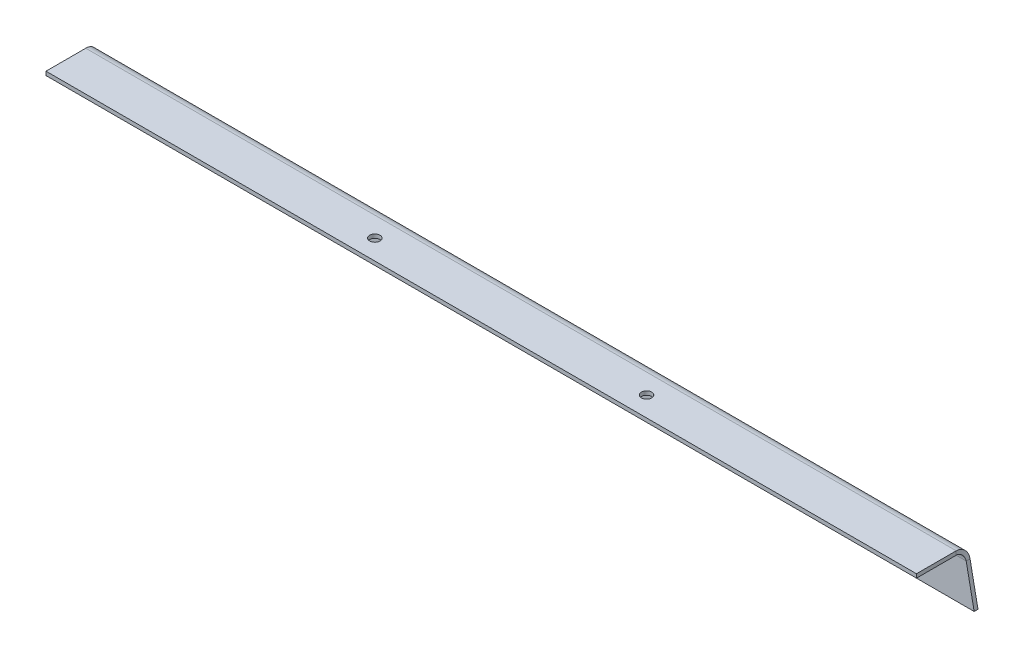
ISO-10303-21;
HEADER;
FILE_DESCRIPTION(('STEP AP214'),'2;1');
FILE_NAME('part.step','',(''),(''),'','','');
FILE_SCHEMA(('AUTOMOTIVE_DESIGN { 1 0 10303 214 1 1 1 1 }'));
ENDSEC;
DATA;
#1=APPLICATION_CONTEXT('core data for automotive mechanical design processes');
#2=APPLICATION_PROTOCOL_DEFINITION('international standard','automotive_design',2000,#1);
#3=PRODUCT_CONTEXT('',#1,'mechanical');
#4=PRODUCT('Part','Part','',(#3));
#5=PRODUCT_RELATED_PRODUCT_CATEGORY('part','',(#4));
#6=PRODUCT_DEFINITION_FORMATION('','',#4);
#7=PRODUCT_DEFINITION_CONTEXT('part definition',#1,'design');
#8=PRODUCT_DEFINITION('design','',#6,#7);
#9=PRODUCT_DEFINITION_SHAPE('','',#8);
#10=(LENGTH_UNIT() NAMED_UNIT(*) SI_UNIT(.MILLI.,.METRE.));
#11=(NAMED_UNIT(*) PLANE_ANGLE_UNIT() SI_UNIT($,.RADIAN.));
#12=(NAMED_UNIT(*) SI_UNIT($,.STERADIAN.) SOLID_ANGLE_UNIT());
#13=UNCERTAINTY_MEASURE_WITH_UNIT(LENGTH_MEASURE(1.E-05),#10,'distance_accuracy_value','');
#14=(GEOMETRIC_REPRESENTATION_CONTEXT(3) GLOBAL_UNCERTAINTY_ASSIGNED_CONTEXT((#13)) GLOBAL_UNIT_ASSIGNED_CONTEXT((#10,
#11,#12)) REPRESENTATION_CONTEXT('',''));
#15=CARTESIAN_POINT('',(0.,0.,0.));
#16=DIRECTION('',(0.,0.,1.));
#17=DIRECTION('',(1.,0.,0.));
#18=AXIS2_PLACEMENT_3D('',#15,#16,#17);
#19=CARTESIAN_POINT('',(0.,0.,-3.));
#20=DIRECTION('',(0.,0.,1.));
#21=DIRECTION('',(1.,0.,0.));
#22=AXIS2_PLACEMENT_3D('',#19,#20,#21);
#23=PLANE('',#22);
#24=DIRECTION('',(0.196116135138184,0.98058067569092,0.));
#25=VECTOR('',#24,1.);
#26=CARTESIAN_POINT('',(-446.554131054131,89.310826210826,-3.));
#27=LINE('',#26,#25);
#28=CARTESIAN_POINT('',(-467.259259259259,-14.2148148148148,-3.));
#29=VERTEX_POINT('',#28);
#30=CARTESIAN_POINT('',(-461.059259259259,16.7851851851852,-3.));
#31=VERTEX_POINT('',#30);
#32=EDGE_CURVE('E86',#29,#31,#27,.T.);
#33=ORIENTED_EDGE('',*,*,#32,.T.);
#34=DIRECTION('',(-1.,0.,0.));
#35=VECTOR('',#34,1.);
#36=CARTESIAN_POINT('',(-467.259259259259,16.7851851851852,-3.00000000000003));
#37=LINE('',#36,#35);
#38=CARTESIAN_POINT('',(221.540740740741,16.7851851851852,-3.00000000000001));
#39=VERTEX_POINT('',#38);
#40=EDGE_CURVE('E155',#31,#39,#37,.F.);
#41=ORIENTED_EDGE('',*,*,#40,.T.);
#42=DIRECTION('',(-0.196116135138184,0.98058067569092,0.));
#43=VECTOR('',#42,1.);
#44=CARTESIAN_POINT('',(219.740740740741,25.7851851851853,-3.));
#45=LINE('',#44,#43);
#46=CARTESIAN_POINT('',(227.740740740741,-14.2148148148148,-3.));
#47=VERTEX_POINT('',#46);
#48=EDGE_CURVE('E192',#47,#39,#45,.T.);
#49=ORIENTED_EDGE('',*,*,#48,.F.);
#50=DIRECTION('',(1.,0.,0.));
#51=VECTOR('',#50,1.);
#52=CARTESIAN_POINT('',(227.740740740741,-14.2148148148148,-3.));
#53=LINE('',#52,#51);
#54=EDGE_CURVE('E169',#29,#47,#53,.T.);
#55=ORIENTED_EDGE('',*,*,#54,.F.);
#56=EDGE_LOOP('',(#33,#41,#49,#55));
#57=FACE_BOUND('',#56,.T.);
#58=ADVANCED_FACE('F61',(#57),#23,.F.);
#59=CARTESIAN_POINT('',(0.,0.,0.));
#60=DIRECTION('',(0.,0.,1.));
#61=DIRECTION('',(1.,0.,0.));
#62=AXIS2_PLACEMENT_3D('',#59,#60,#61);
#63=PLANE('',#62);
#64=DIRECTION('',(-1.,0.,0.));
#65=VECTOR('',#64,1.);
#66=CARTESIAN_POINT('',(-467.259259259259,16.7851851851852,0.));
#67=LINE('',#66,#65);
#68=CARTESIAN_POINT('',(-461.059259259259,16.7851851851852,0.));
#69=VERTEX_POINT('',#68);
#70=CARTESIAN_POINT('',(221.540740740741,16.7851851851852,0.));
#71=VERTEX_POINT('',#70);
#72=EDGE_CURVE('E152',#69,#71,#67,.F.);
#73=ORIENTED_EDGE('',*,*,#72,.F.);
#74=DIRECTION('',(0.196116135138184,0.98058067569092,0.));
#75=VECTOR('',#74,1.);
#76=CARTESIAN_POINT('',(-446.554131054131,89.310826210826,0.));
#77=LINE('',#76,#75);
#78=CARTESIAN_POINT('',(-467.259259259259,-14.2148148148148,0.));
#79=VERTEX_POINT('',#78);
#80=EDGE_CURVE('E217',#79,#69,#77,.T.);
#81=ORIENTED_EDGE('',*,*,#80,.F.);
#82=DIRECTION('',(1.,0.,0.));
#83=VECTOR('',#82,1.);
#84=CARTESIAN_POINT('',(227.740740740741,-14.2148148148148,0.));
#85=LINE('',#84,#83);
#86=CARTESIAN_POINT('',(227.740740740741,-14.2148148148148,0.));
#87=VERTEX_POINT('',#86);
#88=EDGE_CURVE('E167',#79,#87,#85,.T.);
#89=ORIENTED_EDGE('',*,*,#88,.T.);
#90=DIRECTION('',(-0.196116135138184,0.98058067569092,0.));
#91=VECTOR('',#90,1.);
#92=CARTESIAN_POINT('',(219.740740740741,25.7851851851853,0.));
#93=LINE('',#92,#91);
#94=EDGE_CURVE('E189',#87,#71,#93,.T.);
#95=ORIENTED_EDGE('',*,*,#94,.T.);
#96=EDGE_LOOP('',(#73,#81,#89,#95));
#97=FACE_BOUND('',#96,.T.);
#98=ADVANCED_FACE('F240',(#97),#63,.T.);
#99=CARTESIAN_POINT('',(-467.259259259259,16.7851851851852,6.00000000000001));
#100=DIRECTION('',(-1.,0.,0.));
#101=DIRECTION('',(0.,1.,0.));
#102=AXIS2_PLACEMENT_3D('',#99,#100,#101);
#103=CYLINDRICAL_SURFACE('',#102,9.00000000000004);
#104=ORIENTED_EDGE('',*,*,#40,.F.);
#105=CARTESIAN_POINT('',(-461.059259259259,16.7851851851852,6.00000000000001));
#106=DIRECTION('',(0.98058067569092,-0.196116135138184,0.));
#107=DIRECTION('',(-0.196116135138184,-0.98058067569092,0.));
#108=AXIS2_PLACEMENT_3D('',#105,#106,#107);
#109=ELLIPSE('',#108,9.17823512446706,9.00000000000004);
#110=CARTESIAN_POINT('',(-459.259259259259,25.7851851851853,5.99999999999997));
#111=VERTEX_POINT('',#110);
#112=EDGE_CURVE('E207',#111,#31,#109,.F.);
#113=ORIENTED_EDGE('',*,*,#112,.F.);
#114=DIRECTION('',(-1.,0.,0.));
#115=VECTOR('',#114,1.);
#116=CARTESIAN_POINT('',(0.,25.7851851851852,5.99999999999997));
#117=LINE('',#116,#115);
#118=CARTESIAN_POINT('',(219.740740740741,25.7851851851853,5.99999999999997));
#119=VERTEX_POINT('',#118);
#120=EDGE_CURVE('E148',#119,#111,#117,.T.);
#121=ORIENTED_EDGE('',*,*,#120,.F.);
#122=CARTESIAN_POINT('',(221.540740740741,16.7851851851852,6.00000000000001));
#123=DIRECTION('',(-0.98058067569092,-0.196116135138184,0.));
#124=DIRECTION('',(-0.196116135138184,0.98058067569092,0.));
#125=AXIS2_PLACEMENT_3D('',#122,#123,#124);
#126=ELLIPSE('',#125,9.17823512446706,9.00000000000004);
#127=EDGE_CURVE('E205',#39,#119,#126,.F.);
#128=ORIENTED_EDGE('',*,*,#127,.F.);
#129=EDGE_LOOP('',(#104,#113,#121,#128));
#130=FACE_BOUND('',#129,.T.);
#131=ADVANCED_FACE('F248',(#130),#103,.T.);
#132=CARTESIAN_POINT('',(-467.259259259259,16.7851851851852,6.00000000000001));
#133=DIRECTION('',(-1.,0.,0.));
#134=DIRECTION('',(0.,1.,0.));
#135=AXIS2_PLACEMENT_3D('',#132,#133,#134);
#136=CYLINDRICAL_SURFACE('',#135,6.00000000000004);
#137=CARTESIAN_POINT('',(-461.059259259259,16.7851851851852,6.00000000000001));
#138=DIRECTION('',(0.957826285221151,-0.287347885566347,0.));
#139=DIRECTION('',(-0.287347885566347,-0.957826285221151,0.));
#140=AXIS2_PLACEMENT_3D('',#137,#138,#139);
#141=ELLIPSE('',#140,6.26418390534638,6.00000000000004);
#142=CARTESIAN_POINT('',(-459.259259259259,22.7851851851853,5.99999999999999));
#143=VERTEX_POINT('',#142);
#144=EDGE_CURVE('E210',#143,#69,#141,.F.);
#145=ORIENTED_EDGE('',*,*,#144,.T.);
#146=ORIENTED_EDGE('',*,*,#72,.T.);
#147=CARTESIAN_POINT('',(221.540740740741,16.7851851851852,6.00000000000001));
#148=DIRECTION('',(-0.957826285221152,-0.287347885566343,0.));
#149=DIRECTION('',(-0.287347885566343,0.957826285221152,0.));
#150=AXIS2_PLACEMENT_3D('',#147,#148,#149);
#151=ELLIPSE('',#150,6.26418390534637,6.00000000000004);
#152=CARTESIAN_POINT('',(219.740740740741,22.7851851851853,5.99999999999998));
#153=VERTEX_POINT('',#152);
#154=EDGE_CURVE('E203',#71,#153,#151,.F.);
#155=ORIENTED_EDGE('',*,*,#154,.T.);
#156=DIRECTION('',(1.,0.,0.));
#157=VECTOR('',#156,1.);
#158=CARTESIAN_POINT('',(227.740740740741,22.7851851851853,5.99999999999998));
#159=LINE('',#158,#157);
#160=EDGE_CURVE('E163',#153,#143,#159,.F.);
#161=ORIENTED_EDGE('',*,*,#160,.T.);
#162=EDGE_LOOP('',(#145,#146,#155,#161));
#163=FACE_BOUND('',#162,.T.);
#164=ADVANCED_FACE('F229',(#163),#136,.F.);
#165=CARTESIAN_POINT('',(0.,25.7851851851852,0.));
#166=DIRECTION('',(0.,1.,0.));
#167=DIRECTION('',(0.,0.,1.));
#168=AXIS2_PLACEMENT_3D('',#165,#166,#167);
#169=PLANE('',#168);
#170=CARTESIAN_POINT('',(-6.25925925925926,25.7851851851853,21.5));
#171=DIRECTION('',(0.,1.,0.));
#172=DIRECTION('',(0.,0.,1.));
#173=AXIS2_PLACEMENT_3D('',#170,#171,#172);
#174=CIRCLE('',#173,4.);
#175=CARTESIAN_POINT('',(-6.25925925925926,25.7851851851853,25.5));
#176=VERTEX_POINT('',#175);
#177=EDGE_CURVE('E181',#176,#176,#174,.T.);
#178=ORIENTED_EDGE('',*,*,#177,.F.);
#179=EDGE_LOOP('',(#178));
#180=FACE_BOUND('',#179,.T.);
#181=CARTESIAN_POINT('',(-218.259259259259,25.7851851851853,21.5));
#182=DIRECTION('',(0.,1.,0.));
#183=DIRECTION('',(0.,0.,1.));
#184=AXIS2_PLACEMENT_3D('',#181,#182,#183);
#185=CIRCLE('',#184,3.99999999999999);
#186=CARTESIAN_POINT('',(-218.259259259259,25.7851851851853,25.5));
#187=VERTEX_POINT('',#186);
#188=EDGE_CURVE('E159',#187,#187,#185,.T.);
#189=ORIENTED_EDGE('',*,*,#188,.F.);
#190=EDGE_LOOP('',(#189));
#191=FACE_BOUND('',#190,.T.);
#192=ORIENTED_EDGE('',*,*,#120,.T.);
#193=DIRECTION('',(0.,0.,-1.));
#194=VECTOR('',#193,1.);
#195=CARTESIAN_POINT('',(-459.259259259259,25.7851851851853,37.));
#196=LINE('',#195,#194);
#197=CARTESIAN_POINT('',(-459.259259259259,25.7851851851853,37.));
#198=VERTEX_POINT('',#197);
#199=EDGE_CURVE('E133',#198,#111,#196,.T.);
#200=ORIENTED_EDGE('',*,*,#199,.F.);
#201=DIRECTION('',(-1.,0.,0.));
#202=VECTOR('',#201,1.);
#203=CARTESIAN_POINT('',(-467.259259259259,25.7851851851853,37.));
#204=LINE('',#203,#202);
#205=CARTESIAN_POINT('',(219.740740740741,25.7851851851854,37.));
#206=VERTEX_POINT('',#205);
#207=EDGE_CURVE('E146',#206,#198,#204,.T.);
#208=ORIENTED_EDGE('',*,*,#207,.F.);
#209=DIRECTION('',(0.,0.,-1.));
#210=VECTOR('',#209,1.);
#211=CARTESIAN_POINT('',(219.740740740741,25.7851851851853,37.));
#212=LINE('',#211,#210);
#213=EDGE_CURVE('E78',#206,#119,#212,.T.);
#214=ORIENTED_EDGE('',*,*,#213,.T.);
#215=EDGE_LOOP('',(#192,#200,#208,#214));
#216=FACE_BOUND('',#215,.T.);
#217=ADVANCED_FACE('F145',(#180,#191,#216),#169,.T.);
#218=CARTESIAN_POINT('',(0.,22.7851851851852,0.));
#219=DIRECTION('',(0.,1.,0.));
#220=DIRECTION('',(0.,0.,1.));
#221=AXIS2_PLACEMENT_3D('',#218,#219,#220);
#222=PLANE('',#221);
#223=CARTESIAN_POINT('',(-6.25925925925926,22.7851851851853,21.5));
#224=DIRECTION('',(0.,1.,0.));
#225=DIRECTION('',(0.,0.,1.));
#226=AXIS2_PLACEMENT_3D('',#223,#224,#225);
#227=CIRCLE('',#226,4.);
#228=CARTESIAN_POINT('',(-6.25925925925926,22.7851851851853,25.5));
#229=VERTEX_POINT('',#228);
#230=EDGE_CURVE('E65',#229,#229,#227,.T.);
#231=ORIENTED_EDGE('',*,*,#230,.T.);
#232=EDGE_LOOP('',(#231));
#233=FACE_BOUND('',#232,.T.);
#234=CARTESIAN_POINT('',(-218.259259259259,22.7851851851853,21.5));
#235=DIRECTION('',(0.,1.,0.));
#236=DIRECTION('',(0.,0.,1.));
#237=AXIS2_PLACEMENT_3D('',#234,#235,#236);
#238=CIRCLE('',#237,3.99999999999999);
#239=CARTESIAN_POINT('',(-218.259259259259,22.7851851851853,25.5));
#240=VERTEX_POINT('',#239);
#241=EDGE_CURVE('E166',#240,#240,#238,.T.);
#242=ORIENTED_EDGE('',*,*,#241,.T.);
#243=EDGE_LOOP('',(#242));
#244=FACE_BOUND('',#243,.T.);
#245=DIRECTION('',(0.,0.,1.));
#246=VECTOR('',#245,1.);
#247=CARTESIAN_POINT('',(-459.259259259259,22.7851851851852,0.));
#248=LINE('',#247,#246);
#249=CARTESIAN_POINT('',(-459.259259259259,22.7851851851853,37.));
#250=VERTEX_POINT('',#249);
#251=EDGE_CURVE('E136',#250,#143,#248,.F.);
#252=ORIENTED_EDGE('',*,*,#251,.T.);
#253=ORIENTED_EDGE('',*,*,#160,.F.);
#254=DIRECTION('',(0.,0.,1.));
#255=VECTOR('',#254,1.);
#256=CARTESIAN_POINT('',(219.740740740741,22.7851851851852,0.));
#257=LINE('',#256,#255);
#258=CARTESIAN_POINT('',(219.740740740741,22.7851851851854,37.));
#259=VERTEX_POINT('',#258);
#260=EDGE_CURVE('E200',#259,#153,#257,.F.);
#261=ORIENTED_EDGE('',*,*,#260,.F.);
#262=DIRECTION('',(1.,0.,0.));
#263=VECTOR('',#262,1.);
#264=CARTESIAN_POINT('',(0.,22.7851851851853,37.));
#265=LINE('',#264,#263);
#266=EDGE_CURVE('E153',#259,#250,#265,.F.);
#267=ORIENTED_EDGE('',*,*,#266,.T.);
#268=EDGE_LOOP('',(#252,#253,#261,#267));
#269=FACE_BOUND('',#268,.T.);
#270=ADVANCED_FACE('F226',(#233,#244,#269),#222,.F.);
#271=CARTESIAN_POINT('',(-467.259259259259,25.7851851851853,37.));
#272=DIRECTION('',(0.,0.,1.));
#273=DIRECTION('',(0.,-1.,0.));
#274=AXIS2_PLACEMENT_3D('',#271,#272,#273);
#275=PLANE('',#274);
#276=ORIENTED_EDGE('',*,*,#207,.T.);
#277=DIRECTION('',(0.,1.,0.));
#278=VECTOR('',#277,1.);
#279=CARTESIAN_POINT('',(-459.259259259259,25.7851851851853,37.));
#280=LINE('',#279,#278);
#281=EDGE_CURVE('E129',#198,#250,#280,.F.);
#282=ORIENTED_EDGE('',*,*,#281,.T.);
#283=ORIENTED_EDGE('',*,*,#266,.F.);
#284=DIRECTION('',(0.,1.,0.));
#285=VECTOR('',#284,1.);
#286=CARTESIAN_POINT('',(219.740740740741,25.7851851851854,37.));
#287=LINE('',#286,#285);
#288=EDGE_CURVE('E151',#206,#259,#287,.F.);
#289=ORIENTED_EDGE('',*,*,#288,.F.);
#290=EDGE_LOOP('',(#276,#282,#283,#289));
#291=FACE_BOUND('',#290,.T.);
#292=ADVANCED_FACE('F150',(#291),#275,.T.);
#293=CARTESIAN_POINT('',(227.740740740741,-14.2148148148148,-3.));
#294=DIRECTION('',(0.,-1.,0.));
#295=DIRECTION('',(1.,0.,0.));
#296=AXIS2_PLACEMENT_3D('',#293,#294,#295);
#297=PLANE('',#296);
#298=ORIENTED_EDGE('',*,*,#88,.F.);
#299=DIRECTION('',(0.,0.,1.));
#300=VECTOR('',#299,1.);
#301=CARTESIAN_POINT('',(-467.259259259259,-14.2148148148148,-3.));
#302=LINE('',#301,#300);
#303=EDGE_CURVE('E70',#29,#79,#302,.T.);
#304=ORIENTED_EDGE('',*,*,#303,.F.);
#305=ORIENTED_EDGE('',*,*,#54,.T.);
#306=DIRECTION('',(0.,0.,1.));
#307=VECTOR('',#306,1.);
#308=CARTESIAN_POINT('',(227.740740740741,-14.2148148148148,-3.));
#309=LINE('',#308,#307);
#310=EDGE_CURVE('E13',#47,#87,#309,.T.);
#311=ORIENTED_EDGE('',*,*,#310,.T.);
#312=EDGE_LOOP('',(#298,#304,#305,#311));
#313=FACE_BOUND('',#312,.T.);
#314=ADVANCED_FACE('F63',(#313),#297,.T.);
#315=CARTESIAN_POINT('',(-218.259259259259,-14.2148148148149,21.5000000000001));
#316=DIRECTION('',(0.,1.,0.));
#317=DIRECTION('',(0.,0.,1.));
#318=AXIS2_PLACEMENT_3D('',#315,#316,#317);
#319=CYLINDRICAL_SURFACE('',#318,3.99999999999999);
#320=ORIENTED_EDGE('',*,*,#188,.T.);
#321=EDGE_LOOP('',(#320));
#322=FACE_BOUND('',#321,.T.);
#323=ORIENTED_EDGE('',*,*,#241,.F.);
#324=EDGE_LOOP('',(#323));
#325=FACE_BOUND('',#324,.T.);
#326=ADVANCED_FACE('F276',(#322,#325),#319,.F.);
#327=CARTESIAN_POINT('',(-6.25925925925925,-14.2148148148149,21.5000000000001));
#328=DIRECTION('',(0.,1.,0.));
#329=DIRECTION('',(0.,0.,1.));
#330=AXIS2_PLACEMENT_3D('',#327,#328,#329);
#331=CYLINDRICAL_SURFACE('',#330,4.);
#332=ORIENTED_EDGE('',*,*,#177,.T.);
#333=EDGE_LOOP('',(#332));
#334=FACE_BOUND('',#333,.T.);
#335=ORIENTED_EDGE('',*,*,#230,.F.);
#336=EDGE_LOOP('',(#335));
#337=FACE_BOUND('',#336,.T.);
#338=ADVANCED_FACE('F257',(#334,#337),#331,.F.);
#339=CARTESIAN_POINT('',(219.740740740741,25.7851851851853,-3.));
#340=DIRECTION('',(0.98058067569092,0.196116135138184,0.));
#341=DIRECTION('',(-0.196116135138184,0.98058067569092,0.));
#342=AXIS2_PLACEMENT_3D('',#339,#340,#341);
#343=PLANE('',#342);
#344=ORIENTED_EDGE('',*,*,#310,.F.);
#345=ORIENTED_EDGE('',*,*,#48,.T.);
#346=DIRECTION('',(0.,0.,-1.));
#347=VECTOR('',#346,1.);
#348=CARTESIAN_POINT('',(221.540740740741,16.7851851851852,-3.00000000000001));
#349=LINE('',#348,#347);
#350=EDGE_CURVE('E185',#39,#71,#349,.F.);
#351=ORIENTED_EDGE('',*,*,#350,.T.);
#352=ORIENTED_EDGE('',*,*,#94,.F.);
#353=EDGE_LOOP('',(#344,#345,#351,#352));
#354=FACE_BOUND('',#353,.T.);
#355=ADVANCED_FACE('F237',(#354),#343,.T.);
#356=CARTESIAN_POINT('',(219.740740740741,25.7851851851853,37.));
#357=DIRECTION('',(1.,0.,0.));
#358=DIRECTION('',(0.,0.,-1.));
#359=AXIS2_PLACEMENT_3D('',#356,#357,#358);
#360=PLANE('',#359);
#361=ORIENTED_EDGE('',*,*,#213,.F.);
#362=ORIENTED_EDGE('',*,*,#288,.T.);
#363=ORIENTED_EDGE('',*,*,#260,.T.);
#364=DIRECTION('',(0.,1.,0.));
#365=VECTOR('',#364,1.);
#366=CARTESIAN_POINT('',(219.740740740741,25.7851851851853,5.99999999999997));
#367=LINE('',#366,#365);
#368=EDGE_CURVE('E197',#119,#153,#367,.F.);
#369=ORIENTED_EDGE('',*,*,#368,.F.);
#370=EDGE_LOOP('',(#361,#362,#363,#369));
#371=FACE_BOUND('',#370,.T.);
#372=ADVANCED_FACE('F249',(#371),#360,.T.);
#373=CARTESIAN_POINT('',(219.740740740741,25.7851851851853,6.00000000000001));
#374=CARTESIAN_POINT('',(219.740740740741,24.7851851851853,6.00000000000001));
#375=CARTESIAN_POINT('',(219.740740740741,23.7851851851853,6.00000000000001));
#376=CARTESIAN_POINT('',(219.740740740741,22.7851851851853,6.00000000000001));
#377=CARTESIAN_POINT('',(219.740740740741,25.7851851851853,24.0000000000001));
#378=CARTESIAN_POINT('',(219.740740740741,24.7851851851853,22.0000000000001));
#379=CARTESIAN_POINT('',(219.740740740741,23.7851851851853,20.0000000000001));
#380=CARTESIAN_POINT('',(219.740740740741,22.7851851851853,18.0000000000001));
#381=CARTESIAN_POINT('',(223.340740740741,7.78518518518518,24.0000000000001));
#382=CARTESIAN_POINT('',(223.340740740741,8.78518518518518,22.0000000000001));
#383=CARTESIAN_POINT('',(223.340740740741,9.78518518518518,20.0000000000001));
#384=CARTESIAN_POINT('',(223.340740740741,10.7851851851852,18.0000000000001));
#385=CARTESIAN_POINT('',(223.340740740741,7.78518518518518,6.00000000000001));
#386=CARTESIAN_POINT('',(223.340740740741,8.78518518518518,6.00000000000001));
#387=CARTESIAN_POINT('',(223.340740740741,9.78518518518518,6.00000000000001));
#388=CARTESIAN_POINT('',(223.340740740741,10.7851851851852,6.00000000000001));
#389=CARTESIAN_POINT('',(223.340740740741,7.78518518518519,-12.0000000000001));
#390=CARTESIAN_POINT('',(223.340740740741,8.78518518518519,-10.0000000000001));
#391=CARTESIAN_POINT('',(223.340740740741,9.78518518518519,-8.00000000000008));
#392=CARTESIAN_POINT('',(223.340740740741,10.7851851851852,-6.00000000000008));
#393=CARTESIAN_POINT('',(219.740740740741,25.7851851851853,-12.0000000000001));
#394=CARTESIAN_POINT('',(219.740740740741,24.7851851851853,-10.0000000000001));
#395=CARTESIAN_POINT('',(219.740740740741,23.7851851851853,-8.00000000000008));
#396=CARTESIAN_POINT('',(219.740740740741,22.7851851851853,-6.00000000000008));
#397=CARTESIAN_POINT('',(219.740740740741,25.7851851851853,6.00000000000001));
#398=CARTESIAN_POINT('',(219.740740740741,24.7851851851853,6.00000000000001));
#399=CARTESIAN_POINT('',(219.740740740741,23.7851851851853,6.00000000000001));
#400=CARTESIAN_POINT('',(219.740740740741,22.7851851851853,6.00000000000001));
#401=(BOUNDED_SURFACE() B_SPLINE_SURFACE(3,3,((#373,#374,#375,#376),(#377,#378,#379,#380),(#381,
#382,#383,#384),(#385,#386,#387,#388),(#389,#390,#391,#392),(#393,#394,#395,#396),(#397,#398,
#399,#400)),.UNSPECIFIED.,.T.,.F.,.F.) B_SPLINE_SURFACE_WITH_KNOTS((4,3,4),(4,4),(0.,0.5,1.),
(0.,1.),.UNSPECIFIED.) GEOMETRIC_REPRESENTATION_ITEM() RATIONAL_B_SPLINE_SURFACE(((1.,1.,1.,1.),
(0.333333333333333,0.333333333333333,0.333333333333333,0.333333333333333),(0.333333333333333,
0.333333333333333,0.333333333333333,0.333333333333333),(1.,1.,1.,1.),(0.333333333333333,
0.333333333333333,0.333333333333333,0.333333333333333),(0.333333333333333,0.333333333333333,
0.333333333333333,0.333333333333333),(1.,1.,1.,1.))) REPRESENTATION_ITEM('') SURFACE());
#402=ORIENTED_EDGE('',*,*,#127,.T.);
#403=ORIENTED_EDGE('',*,*,#368,.T.);
#404=ORIENTED_EDGE('',*,*,#154,.F.);
#405=ORIENTED_EDGE('',*,*,#350,.F.);
#406=EDGE_LOOP('',(#402,#403,#404,#405));
#407=FACE_BOUND('',#406,.T.);
#408=ADVANCED_FACE('F234',(#407),#401,.T.);
#409=CARTESIAN_POINT('',(-459.259259259259,25.7851851851853,37.));
#410=DIRECTION('',(1.,0.,0.));
#411=DIRECTION('',(0.,0.,-1.));
#412=AXIS2_PLACEMENT_3D('',#409,#410,#411);
#413=PLANE('',#412);
#414=ORIENTED_EDGE('',*,*,#199,.T.);
#415=DIRECTION('',(0.,1.,0.));
#416=VECTOR('',#415,1.);
#417=CARTESIAN_POINT('',(-459.259259259259,25.7851851851853,5.99999999999997));
#418=LINE('',#417,#416);
#419=EDGE_CURVE('E214',#111,#143,#418,.F.);
#420=ORIENTED_EDGE('',*,*,#419,.T.);
#421=ORIENTED_EDGE('',*,*,#251,.F.);
#422=ORIENTED_EDGE('',*,*,#281,.F.);
#423=EDGE_LOOP('',(#414,#420,#421,#422));
#424=FACE_BOUND('',#423,.T.);
#425=ADVANCED_FACE('F131',(#424),#413,.F.);
#426=CARTESIAN_POINT('',(-446.554131054131,89.310826210826,0.));
#427=DIRECTION('',(0.98058067569092,-0.196116135138184,0.));
#428=DIRECTION('',(0.196116135138184,0.98058067569092,0.));
#429=AXIS2_PLACEMENT_3D('',#426,#427,#428);
#430=PLANE('',#429);
#431=ORIENTED_EDGE('',*,*,#80,.T.);
#432=DIRECTION('',(0.,0.,1.));
#433=VECTOR('',#432,1.);
#434=CARTESIAN_POINT('',(-461.059259259259,16.7851851851852,0.));
#435=LINE('',#434,#433);
#436=EDGE_CURVE('E213',#69,#31,#435,.F.);
#437=ORIENTED_EDGE('',*,*,#436,.T.);
#438=ORIENTED_EDGE('',*,*,#32,.F.);
#439=ORIENTED_EDGE('',*,*,#303,.T.);
#440=EDGE_LOOP('',(#431,#437,#438,#439));
#441=FACE_BOUND('',#440,.T.);
#442=ADVANCED_FACE('F317',(#441),#430,.F.);
#443=CARTESIAN_POINT('',(-462.859259259259,7.78518518518518,6.00000000000001));
#444=CARTESIAN_POINT('',(-462.859259259259,8.78518518518518,6.00000000000001));
#445=CARTESIAN_POINT('',(-462.859259259259,9.78518518518518,6.00000000000001));
#446=CARTESIAN_POINT('',(-462.859259259259,10.7851851851852,6.00000000000001));
#447=CARTESIAN_POINT('',(-462.859259259259,7.78518518518518,24.0000000000001));
#448=CARTESIAN_POINT('',(-462.859259259259,8.78518518518519,22.0000000000001));
#449=CARTESIAN_POINT('',(-462.859259259259,9.78518518518519,20.0000000000001));
#450=CARTESIAN_POINT('',(-462.859259259259,10.7851851851852,18.0000000000001));
#451=CARTESIAN_POINT('',(-459.259259259259,25.7851851851853,24.0000000000001));
#452=CARTESIAN_POINT('',(-459.259259259259,24.7851851851853,22.0000000000001));
#453=CARTESIAN_POINT('',(-459.259259259259,23.7851851851853,20.0000000000001));
#454=CARTESIAN_POINT('',(-459.259259259259,22.7851851851853,18.0000000000001));
#455=CARTESIAN_POINT('',(-459.259259259259,25.7851851851853,6.00000000000001));
#456=CARTESIAN_POINT('',(-459.259259259259,24.7851851851853,6.00000000000001));
#457=CARTESIAN_POINT('',(-459.259259259259,23.7851851851853,6.00000000000001));
#458=CARTESIAN_POINT('',(-459.259259259259,22.7851851851853,6.00000000000001));
#459=CARTESIAN_POINT('',(-459.259259259259,25.7851851851853,-12.0000000000001));
#460=CARTESIAN_POINT('',(-459.259259259259,24.7851851851853,-10.0000000000001));
#461=CARTESIAN_POINT('',(-459.259259259259,23.7851851851853,-8.00000000000008));
#462=CARTESIAN_POINT('',(-459.259259259259,22.7851851851853,-6.00000000000008));
#463=CARTESIAN_POINT('',(-462.859259259259,7.78518518518518,-12.0000000000001));
#464=CARTESIAN_POINT('',(-462.859259259259,8.78518518518519,-10.0000000000001));
#465=CARTESIAN_POINT('',(-462.859259259259,9.78518518518519,-8.00000000000008));
#466=CARTESIAN_POINT('',(-462.859259259259,10.7851851851852,-6.00000000000008));
#467=CARTESIAN_POINT('',(-462.859259259259,7.78518518518518,6.00000000000001));
#468=CARTESIAN_POINT('',(-462.859259259259,8.78518518518518,6.00000000000001));
#469=CARTESIAN_POINT('',(-462.859259259259,9.78518518518518,6.00000000000001));
#470=CARTESIAN_POINT('',(-462.859259259259,10.7851851851852,6.00000000000001));
#471=(BOUNDED_SURFACE() B_SPLINE_SURFACE(3,3,((#443,#444,#445,#446),(#447,#448,#449,#450),(#451,
#452,#453,#454),(#455,#456,#457,#458),(#459,#460,#461,#462),(#463,#464,#465,#466),(#467,#468,
#469,#470)),.UNSPECIFIED.,.T.,.F.,.F.) B_SPLINE_SURFACE_WITH_KNOTS((4,3,4),(4,4),(0.,0.5,1.),
(0.,1.),.UNSPECIFIED.) GEOMETRIC_REPRESENTATION_ITEM() RATIONAL_B_SPLINE_SURFACE(((1.,1.,1.,1.),
(0.333333333333333,0.333333333333333,0.333333333333333,0.333333333333333),(0.333333333333333,
0.333333333333333,0.333333333333333,0.333333333333333),(1.,1.,1.,1.),(0.333333333333333,
0.333333333333333,0.333333333333333,0.333333333333333),(0.333333333333333,0.333333333333333,
0.333333333333333,0.333333333333333),(1.,1.,1.,1.))) REPRESENTATION_ITEM('') SURFACE());
#472=ORIENTED_EDGE('',*,*,#112,.T.);
#473=ORIENTED_EDGE('',*,*,#436,.F.);
#474=ORIENTED_EDGE('',*,*,#144,.F.);
#475=ORIENTED_EDGE('',*,*,#419,.F.);
#476=EDGE_LOOP('',(#472,#473,#474,#475));
#477=FACE_BOUND('',#476,.T.);
#478=ADVANCED_FACE('F327',(#477),#471,.T.);
#479=CLOSED_SHELL('',(#58,#98,#131,#164,#217,#270,#292,#314,#326,#338,#355,#372,#408,#425,#442,#478));
#480=MANIFOLD_SOLID_BREP('B2',#479);
#481=ADVANCED_BREP_SHAPE_REPRESENTATION('',(#18,#480),#14);
#482=SHAPE_DEFINITION_REPRESENTATION(#9,#481);
ENDSEC;
END-ISO-10303-21;
